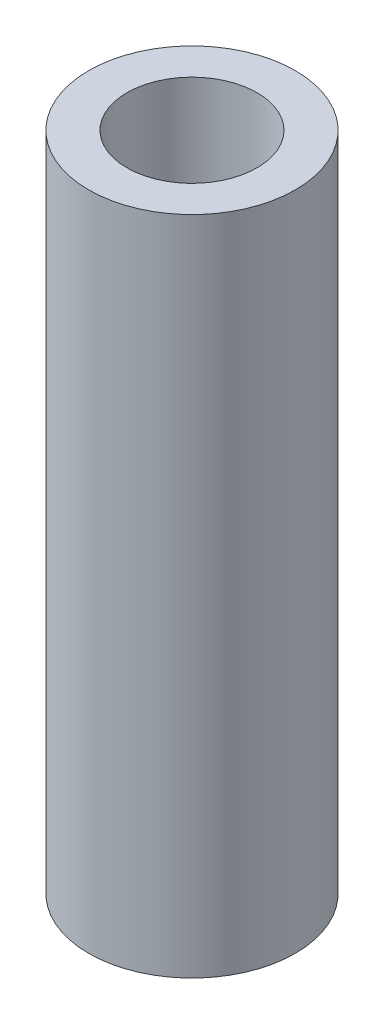
ISO-10303-21;
HEADER;
FILE_DESCRIPTION(('STEP AP214'),'2;1');
FILE_NAME('part.step','',(''),(''),'','','');
FILE_SCHEMA(('AUTOMOTIVE_DESIGN { 1 0 10303 214 1 1 1 1 }'));
ENDSEC;
DATA;
#1=APPLICATION_CONTEXT('core data for automotive mechanical design processes');
#2=APPLICATION_PROTOCOL_DEFINITION('international standard','automotive_design',2000,#1);
#3=PRODUCT_CONTEXT('',#1,'mechanical');
#4=PRODUCT('Part','Part','',(#3));
#5=PRODUCT_RELATED_PRODUCT_CATEGORY('part','',(#4));
#6=PRODUCT_DEFINITION_FORMATION('','',#4);
#7=PRODUCT_DEFINITION_CONTEXT('part definition',#1,'design');
#8=PRODUCT_DEFINITION('design','',#6,#7);
#9=PRODUCT_DEFINITION_SHAPE('','',#8);
#10=(LENGTH_UNIT() NAMED_UNIT(*) SI_UNIT(.MILLI.,.METRE.));
#11=(NAMED_UNIT(*) PLANE_ANGLE_UNIT() SI_UNIT($,.RADIAN.));
#12=(NAMED_UNIT(*) SI_UNIT($,.STERADIAN.) SOLID_ANGLE_UNIT());
#13=UNCERTAINTY_MEASURE_WITH_UNIT(LENGTH_MEASURE(1.E-05),#10,'distance_accuracy_value','');
#14=(GEOMETRIC_REPRESENTATION_CONTEXT(3) GLOBAL_UNCERTAINTY_ASSIGNED_CONTEXT((#13)) GLOBAL_UNIT_ASSIGNED_CONTEXT((#10,
#11,#12)) REPRESENTATION_CONTEXT('',''));
#15=CARTESIAN_POINT('',(0.,0.,0.));
#16=DIRECTION('',(0.,0.,1.));
#17=DIRECTION('',(1.,0.,0.));
#18=AXIS2_PLACEMENT_3D('',#15,#16,#17);
#19=CARTESIAN_POINT('',(0.,-20.32,0.));
#20=DIRECTION('',(0.,1.,0.));
#21=DIRECTION('',(0.,0.,1.));
#22=AXIS2_PLACEMENT_3D('',#19,#20,#21);
#23=CYLINDRICAL_SURFACE('',#22,3.175);
#24=CARTESIAN_POINT('',(0.,-20.32,0.));
#25=DIRECTION('',(0.,1.,0.));
#26=DIRECTION('',(0.,0.,1.));
#27=AXIS2_PLACEMENT_3D('',#24,#25,#26);
#28=CIRCLE('',#27,3.175);
#29=CARTESIAN_POINT('',(0.,-20.32,3.175));
#30=VERTEX_POINT('',#29);
#31=EDGE_CURVE('E10',#30,#30,#28,.T.);
#32=ORIENTED_EDGE('',*,*,#31,.T.);
#33=EDGE_LOOP('',(#32));
#34=FACE_BOUND('',#33,.T.);
#35=CARTESIAN_POINT('',(0.,0.,0.));
#36=DIRECTION('',(0.,1.,0.));
#37=DIRECTION('',(0.,0.,1.));
#38=AXIS2_PLACEMENT_3D('',#35,#36,#37);
#39=CIRCLE('',#38,3.175);
#40=CARTESIAN_POINT('',(0.,0.,3.175));
#41=VERTEX_POINT('',#40);
#42=EDGE_CURVE('E40',#41,#41,#39,.T.);
#43=ORIENTED_EDGE('',*,*,#42,.F.);
#44=EDGE_LOOP('',(#43));
#45=FACE_BOUND('',#44,.T.);
#46=ADVANCED_FACE('F37',(#34,#45),#23,.T.);
#47=CARTESIAN_POINT('',(0.,-20.32,0.));
#48=DIRECTION('',(0.,1.,0.));
#49=DIRECTION('',(0.,0.,1.));
#50=AXIS2_PLACEMENT_3D('',#47,#48,#49);
#51=PLANE('',#50);
#52=CARTESIAN_POINT('',(0.,-20.32,0.));
#53=DIRECTION('',(0.,1.,0.));
#54=DIRECTION('',(0.,0.,1.));
#55=AXIS2_PLACEMENT_3D('',#52,#53,#54);
#56=CIRCLE('',#55,2.);
#57=CARTESIAN_POINT('',(0.,-20.32,2.));
#58=VERTEX_POINT('',#57);
#59=EDGE_CURVE('E49',#58,#58,#56,.T.);
#60=ORIENTED_EDGE('',*,*,#59,.T.);
#61=EDGE_LOOP('',(#60));
#62=FACE_BOUND('',#61,.T.);
#63=ORIENTED_EDGE('',*,*,#31,.F.);
#64=EDGE_LOOP('',(#63));
#65=FACE_BOUND('',#64,.T.);
#66=ADVANCED_FACE('F59',(#62,#65),#51,.F.);
#67=CARTESIAN_POINT('',(0.,0.,0.));
#68=DIRECTION('',(0.,1.,0.));
#69=DIRECTION('',(0.,0.,1.));
#70=AXIS2_PLACEMENT_3D('',#67,#68,#69);
#71=PLANE('',#70);
#72=CARTESIAN_POINT('',(0.,0.,0.));
#73=DIRECTION('',(0.,1.,0.));
#74=DIRECTION('',(0.,0.,1.));
#75=AXIS2_PLACEMENT_3D('',#72,#73,#74);
#76=CIRCLE('',#75,2.);
#77=CARTESIAN_POINT('',(0.,0.,2.));
#78=VERTEX_POINT('',#77);
#79=EDGE_CURVE('E51',#78,#78,#76,.T.);
#80=ORIENTED_EDGE('',*,*,#79,.F.);
#81=EDGE_LOOP('',(#80));
#82=FACE_BOUND('',#81,.T.);
#83=ORIENTED_EDGE('',*,*,#42,.T.);
#84=EDGE_LOOP('',(#83));
#85=FACE_BOUND('',#84,.T.);
#86=ADVANCED_FACE('F65',(#82,#85),#71,.T.);
#87=CARTESIAN_POINT('',(0.,-20.32,0.));
#88=DIRECTION('',(0.,1.,0.));
#89=DIRECTION('',(0.,0.,1.));
#90=AXIS2_PLACEMENT_3D('',#87,#88,#89);
#91=CYLINDRICAL_SURFACE('',#90,2.);
#92=ORIENTED_EDGE('',*,*,#59,.F.);
#93=EDGE_LOOP('',(#92));
#94=FACE_BOUND('',#93,.T.);
#95=ORIENTED_EDGE('',*,*,#79,.T.);
#96=EDGE_LOOP('',(#95));
#97=FACE_BOUND('',#96,.T.);
#98=ADVANCED_FACE('F62',(#94,#97),#91,.F.);
#99=CLOSED_SHELL('',(#46,#66,#86,#98));
#100=MANIFOLD_SOLID_BREP('B2',#99);
#101=ADVANCED_BREP_SHAPE_REPRESENTATION('',(#18,#100),#14);
#102=SHAPE_DEFINITION_REPRESENTATION(#9,#101);
ENDSEC;
END-ISO-10303-21;
